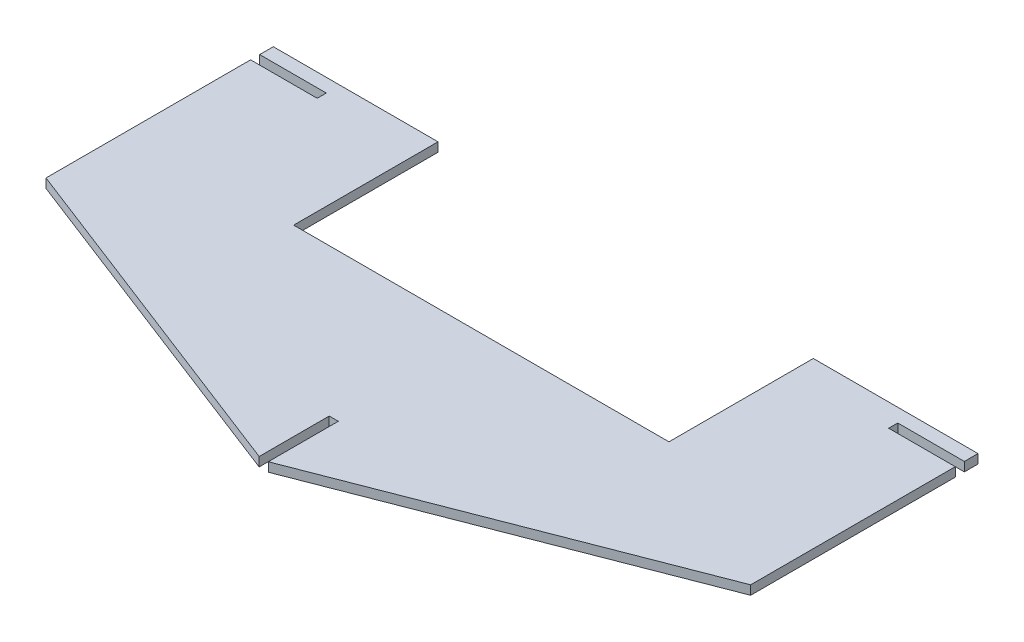
ISO-10303-21;
HEADER;
FILE_DESCRIPTION(('STEP AP214'),'2;1');
FILE_NAME('part.step','',(''),(''),'','','');
FILE_SCHEMA(('AUTOMOTIVE_DESIGN { 1 0 10303 214 1 1 1 1 }'));
ENDSEC;
DATA;
#1=APPLICATION_CONTEXT('core data for automotive mechanical design processes');
#2=APPLICATION_PROTOCOL_DEFINITION('international standard','automotive_design',2000,#1);
#3=PRODUCT_CONTEXT('',#1,'mechanical');
#4=PRODUCT('Part','Part','',(#3));
#5=PRODUCT_RELATED_PRODUCT_CATEGORY('part','',(#4));
#6=PRODUCT_DEFINITION_FORMATION('','',#4);
#7=PRODUCT_DEFINITION_CONTEXT('part definition',#1,'design');
#8=PRODUCT_DEFINITION('design','',#6,#7);
#9=PRODUCT_DEFINITION_SHAPE('','',#8);
#10=(LENGTH_UNIT() NAMED_UNIT(*) SI_UNIT(.MILLI.,.METRE.));
#11=(NAMED_UNIT(*) PLANE_ANGLE_UNIT() SI_UNIT($,.RADIAN.));
#12=(NAMED_UNIT(*) SI_UNIT($,.STERADIAN.) SOLID_ANGLE_UNIT());
#13=UNCERTAINTY_MEASURE_WITH_UNIT(LENGTH_MEASURE(1.E-05),#10,'distance_accuracy_value','');
#14=(GEOMETRIC_REPRESENTATION_CONTEXT(3) GLOBAL_UNCERTAINTY_ASSIGNED_CONTEXT((#13)) GLOBAL_UNIT_ASSIGNED_CONTEXT((#10,
#11,#12)) REPRESENTATION_CONTEXT('',''));
#15=CARTESIAN_POINT('',(0.,0.,0.));
#16=DIRECTION('',(0.,0.,1.));
#17=DIRECTION('',(1.,0.,0.));
#18=AXIS2_PLACEMENT_3D('',#15,#16,#17);
#19=CARTESIAN_POINT('',(0.,4.,0.));
#20=DIRECTION('',(0.,0.,-1.));
#21=DIRECTION('',(-1.,0.,0.));
#22=AXIS2_PLACEMENT_3D('',#19,#20,#21);
#23=PLANE('',#22);
#24=DIRECTION('',(0.,1.,0.));
#25=VECTOR('',#24,1.);
#26=CARTESIAN_POINT('',(72.45,0.,0.));
#27=LINE('',#26,#25);
#28=CARTESIAN_POINT('',(72.45,0.,0.));
#29=VERTEX_POINT('',#28);
#30=CARTESIAN_POINT('',(72.45,4.,0.));
#31=VERTEX_POINT('',#30);
#32=EDGE_CURVE('E196',#29,#31,#27,.T.);
#33=ORIENTED_EDGE('',*,*,#32,.F.);
#34=DIRECTION('',(1.,0.,0.));
#35=VECTOR('',#34,1.);
#36=CARTESIAN_POINT('',(0.,0.,0.));
#37=LINE('',#36,#35);
#38=CARTESIAN_POINT('',(0.,0.,0.));
#39=VERTEX_POINT('',#38);
#40=EDGE_CURVE('E209',#39,#29,#37,.T.);
#41=ORIENTED_EDGE('',*,*,#40,.F.);
#42=DIRECTION('',(0.,-1.,0.));
#43=VECTOR('',#42,1.);
#44=CARTESIAN_POINT('',(0.,4.,0.));
#45=LINE('',#44,#43);
#46=CARTESIAN_POINT('',(0.,4.,0.));
#47=VERTEX_POINT('',#46);
#48=EDGE_CURVE('E248',#47,#39,#45,.T.);
#49=ORIENTED_EDGE('',*,*,#48,.F.);
#50=DIRECTION('',(1.,0.,0.));
#51=VECTOR('',#50,1.);
#52=CARTESIAN_POINT('',(0.,4.,0.));
#53=LINE('',#52,#51);
#54=EDGE_CURVE('E313',#47,#31,#53,.T.);
#55=ORIENTED_EDGE('',*,*,#54,.T.);
#56=EDGE_LOOP('',(#33,#41,#49,#55));
#57=FACE_BOUND('',#56,.T.);
#58=ADVANCED_FACE('F35',(#57),#23,.T.);
#59=CARTESIAN_POINT('',(74.0633484162896,4.,191.330316742081));
#60=DIRECTION('',(-0.360994102557712,0.,-0.93256809827409));
#61=DIRECTION('',(-0.93256809827409,0.,0.360994102557712));
#62=AXIS2_PLACEMENT_3D('',#59,#60,#61);
#63=PLANE('',#62);
#64=DIRECTION('',(0.93256809827409,0.,-0.360994102557712));
#65=VECTOR('',#64,1.);
#66=CARTESIAN_POINT('',(74.0633484162896,0.,191.330316742081));
#67=LINE('',#66,#65);
#68=CARTESIAN_POINT('',(157.,0.,159.225806451613));
#69=VERTEX_POINT('',#68);
#70=CARTESIAN_POINT('',(310.,0.,100.));
#71=VERTEX_POINT('',#70);
#72=EDGE_CURVE('E193',#69,#71,#67,.T.);
#73=ORIENTED_EDGE('',*,*,#72,.T.);
#74=DIRECTION('',(0.,-1.,0.));
#75=VECTOR('',#74,1.);
#76=CARTESIAN_POINT('',(310.,4.,100.));
#77=LINE('',#76,#75);
#78=CARTESIAN_POINT('',(310.,4.,100.));
#79=VERTEX_POINT('',#78);
#80=EDGE_CURVE('E11',#79,#71,#77,.T.);
#81=ORIENTED_EDGE('',*,*,#80,.F.);
#82=DIRECTION('',(0.93256809827409,0.,-0.360994102557712));
#83=VECTOR('',#82,1.);
#84=CARTESIAN_POINT('',(74.0633484162896,4.,191.330316742081));
#85=LINE('',#84,#83);
#86=CARTESIAN_POINT('',(157.,4.,159.225806451613));
#87=VERTEX_POINT('',#86);
#88=EDGE_CURVE('E121',#87,#79,#85,.T.);
#89=ORIENTED_EDGE('',*,*,#88,.F.);
#90=DIRECTION('',(0.,-1.,0.));
#91=VECTOR('',#90,1.);
#92=CARTESIAN_POINT('',(157.,4.,159.225806451613));
#93=LINE('',#92,#91);
#94=EDGE_CURVE('E59',#87,#69,#93,.T.);
#95=ORIENTED_EDGE('',*,*,#94,.T.);
#96=EDGE_LOOP('',(#73,#81,#89,#95));
#97=FACE_BOUND('',#96,.T.);
#98=ADVANCED_FACE('F37',(#97),#63,.F.);
#99=CARTESIAN_POINT('',(310.,4.,0.));
#100=DIRECTION('',(1.,0.,0.));
#101=DIRECTION('',(0.,0.,-1.));
#102=AXIS2_PLACEMENT_3D('',#99,#100,#101);
#103=PLANE('',#102);
#104=DIRECTION('',(0.,0.,1.));
#105=VECTOR('',#104,1.);
#106=CARTESIAN_POINT('',(310.,0.,0.));
#107=LINE('',#106,#105);
#108=CARTESIAN_POINT('',(310.,0.,10.));
#109=VERTEX_POINT('',#108);
#110=EDGE_CURVE('E195',#109,#71,#107,.T.);
#111=ORIENTED_EDGE('',*,*,#110,.F.);
#112=DIRECTION('',(0.,-1.,0.));
#113=VECTOR('',#112,1.);
#114=CARTESIAN_POINT('',(310.,4.,10.));
#115=LINE('',#114,#113);
#116=CARTESIAN_POINT('',(310.,4.,10.));
#117=VERTEX_POINT('',#116);
#118=EDGE_CURVE('E43',#117,#109,#115,.T.);
#119=ORIENTED_EDGE('',*,*,#118,.F.);
#120=DIRECTION('',(0.,0.,1.));
#121=VECTOR('',#120,1.);
#122=CARTESIAN_POINT('',(310.,4.,0.));
#123=LINE('',#122,#121);
#124=EDGE_CURVE('E271',#117,#79,#123,.T.);
#125=ORIENTED_EDGE('',*,*,#124,.T.);
#126=ORIENTED_EDGE('',*,*,#80,.T.);
#127=EDGE_LOOP('',(#111,#119,#125,#126));
#128=FACE_BOUND('',#127,.T.);
#129=ADVANCED_FACE('F270',(#128),#103,.T.);
#130=CARTESIAN_POINT('',(0.,4.,10.));
#131=DIRECTION('',(0.,0.,1.));
#132=DIRECTION('',(1.,0.,0.));
#133=AXIS2_PLACEMENT_3D('',#130,#131,#132);
#134=PLANE('',#133);
#135=DIRECTION('',(-1.,0.,0.));
#136=VECTOR('',#135,1.);
#137=CARTESIAN_POINT('',(0.,0.,10.));
#138=LINE('',#137,#136);
#139=CARTESIAN_POINT('',(280.7,0.,10.));
#140=VERTEX_POINT('',#139);
#141=EDGE_CURVE('E199',#109,#140,#138,.T.);
#142=ORIENTED_EDGE('',*,*,#141,.T.);
#143=DIRECTION('',(0.,-1.,0.));
#144=VECTOR('',#143,1.);
#145=CARTESIAN_POINT('',(280.7,4.,10.));
#146=LINE('',#145,#144);
#147=CARTESIAN_POINT('',(280.7,4.,10.));
#148=VERTEX_POINT('',#147);
#149=EDGE_CURVE('E257',#148,#140,#146,.T.);
#150=ORIENTED_EDGE('',*,*,#149,.F.);
#151=DIRECTION('',(-1.,0.,0.));
#152=VECTOR('',#151,1.);
#153=CARTESIAN_POINT('',(0.,4.,10.));
#154=LINE('',#153,#152);
#155=EDGE_CURVE('E263',#117,#148,#154,.T.);
#156=ORIENTED_EDGE('',*,*,#155,.F.);
#157=ORIENTED_EDGE('',*,*,#118,.T.);
#158=EDGE_LOOP('',(#142,#150,#156,#157));
#159=FACE_BOUND('',#158,.T.);
#160=ADVANCED_FACE('F261',(#159),#134,.F.);
#161=CARTESIAN_POINT('',(280.7,4.,0.));
#162=DIRECTION('',(1.,0.,0.));
#163=DIRECTION('',(0.,0.,-1.));
#164=AXIS2_PLACEMENT_3D('',#161,#162,#163);
#165=PLANE('',#164);
#166=DIRECTION('',(0.,0.,1.));
#167=VECTOR('',#166,1.);
#168=CARTESIAN_POINT('',(280.7,0.,0.));
#169=LINE('',#168,#167);
#170=CARTESIAN_POINT('',(280.7,0.,6.));
#171=VERTEX_POINT('',#170);
#172=EDGE_CURVE('E203',#171,#140,#169,.T.);
#173=ORIENTED_EDGE('',*,*,#172,.F.);
#174=DIRECTION('',(0.,-1.,0.));
#175=VECTOR('',#174,1.);
#176=CARTESIAN_POINT('',(280.7,4.,6.));
#177=LINE('',#176,#175);
#178=CARTESIAN_POINT('',(280.7,4.,6.));
#179=VERTEX_POINT('',#178);
#180=EDGE_CURVE('E255',#179,#171,#177,.T.);
#181=ORIENTED_EDGE('',*,*,#180,.F.);
#182=DIRECTION('',(0.,0.,1.));
#183=VECTOR('',#182,1.);
#184=CARTESIAN_POINT('',(280.7,4.,0.));
#185=LINE('',#184,#183);
#186=EDGE_CURVE('E336',#179,#148,#185,.T.);
#187=ORIENTED_EDGE('',*,*,#186,.T.);
#188=ORIENTED_EDGE('',*,*,#149,.T.);
#189=EDGE_LOOP('',(#173,#181,#187,#188));
#190=FACE_BOUND('',#189,.T.);
#191=ADVANCED_FACE('F414',(#190),#165,.T.);
#192=CARTESIAN_POINT('',(0.,4.,5.99999999999999));
#193=DIRECTION('',(0.,0.,1.));
#194=DIRECTION('',(1.,0.,0.));
#195=AXIS2_PLACEMENT_3D('',#192,#193,#194);
#196=PLANE('',#195);
#197=DIRECTION('',(-1.,0.,0.));
#198=VECTOR('',#197,1.);
#199=CARTESIAN_POINT('',(0.,0.,5.99999999999999));
#200=LINE('',#199,#198);
#201=CARTESIAN_POINT('',(310.,0.,6.));
#202=VERTEX_POINT('',#201);
#203=EDGE_CURVE('E206',#202,#171,#200,.T.);
#204=ORIENTED_EDGE('',*,*,#203,.F.);
#205=DIRECTION('',(0.,-1.,0.));
#206=VECTOR('',#205,1.);
#207=CARTESIAN_POINT('',(310.,4.,6.));
#208=LINE('',#207,#206);
#209=CARTESIAN_POINT('',(310.,4.,6.));
#210=VERTEX_POINT('',#209);
#211=EDGE_CURVE('E253',#210,#202,#208,.T.);
#212=ORIENTED_EDGE('',*,*,#211,.F.);
#213=DIRECTION('',(-1.,0.,0.));
#214=VECTOR('',#213,1.);
#215=CARTESIAN_POINT('',(0.,4.,5.99999999999999));
#216=LINE('',#215,#214);
#217=EDGE_CURVE('E339',#210,#179,#216,.T.);
#218=ORIENTED_EDGE('',*,*,#217,.T.);
#219=ORIENTED_EDGE('',*,*,#180,.T.);
#220=EDGE_LOOP('',(#204,#212,#218,#219));
#221=FACE_BOUND('',#220,.T.);
#222=ADVANCED_FACE('F410',(#221),#196,.T.);
#223=CARTESIAN_POINT('',(310.,0.,0.));
#224=VERTEX_POINT('',#223);
#225=EDGE_CURVE('E200',#224,#202,#107,.T.);
#226=ORIENTED_EDGE('',*,*,#225,.F.);
#227=DIRECTION('',(0.,-1.,0.));
#228=VECTOR('',#227,1.);
#229=CARTESIAN_POINT('',(310.,4.,0.));
#230=LINE('',#229,#228);
#231=CARTESIAN_POINT('',(310.,4.,0.));
#232=VERTEX_POINT('',#231);
#233=EDGE_CURVE('E250',#232,#224,#230,.T.);
#234=ORIENTED_EDGE('',*,*,#233,.F.);
#235=EDGE_CURVE('E334',#232,#210,#123,.T.);
#236=ORIENTED_EDGE('',*,*,#235,.T.);
#237=ORIENTED_EDGE('',*,*,#211,.T.);
#238=EDGE_LOOP('',(#226,#234,#236,#237));
#239=FACE_BOUND('',#238,.T.);
#240=ADVANCED_FACE('F376',(#239),#103,.T.);
#241=DIRECTION('',(0.,1.,0.));
#242=VECTOR('',#241,1.);
#243=CARTESIAN_POINT('',(237.55,0.,0.));
#244=LINE('',#243,#242);
#245=CARTESIAN_POINT('',(237.55,0.,0.));
#246=VERTEX_POINT('',#245);
#247=CARTESIAN_POINT('',(237.55,4.,0.));
#248=VERTEX_POINT('',#247);
#249=EDGE_CURVE('E319',#246,#248,#244,.T.);
#250=ORIENTED_EDGE('',*,*,#249,.T.);
#251=EDGE_CURVE('E343',#248,#232,#53,.T.);
#252=ORIENTED_EDGE('',*,*,#251,.T.);
#253=ORIENTED_EDGE('',*,*,#233,.T.);
#254=EDGE_CURVE('E213',#246,#224,#37,.T.);
#255=ORIENTED_EDGE('',*,*,#254,.F.);
#256=EDGE_LOOP('',(#250,#252,#253,#255));
#257=FACE_BOUND('',#256,.T.);
#258=ADVANCED_FACE('F369',(#257),#23,.T.);
#259=CARTESIAN_POINT('',(0.,4.,0.));
#260=DIRECTION('',(1.,0.,0.));
#261=DIRECTION('',(0.,0.,-1.));
#262=AXIS2_PLACEMENT_3D('',#259,#260,#261);
#263=PLANE('',#262);
#264=DIRECTION('',(0.,0.,1.));
#265=VECTOR('',#264,1.);
#266=CARTESIAN_POINT('',(0.,0.,0.));
#267=LINE('',#266,#265);
#268=CARTESIAN_POINT('',(0.,0.,6.));
#269=VERTEX_POINT('',#268);
#270=EDGE_CURVE('E212',#39,#269,#267,.T.);
#271=ORIENTED_EDGE('',*,*,#270,.T.);
#272=DIRECTION('',(0.,-1.,0.));
#273=VECTOR('',#272,1.);
#274=CARTESIAN_POINT('',(0.,4.,6.));
#275=LINE('',#274,#273);
#276=CARTESIAN_POINT('',(0.,4.,6.));
#277=VERTEX_POINT('',#276);
#278=EDGE_CURVE('E245',#277,#269,#275,.T.);
#279=ORIENTED_EDGE('',*,*,#278,.F.);
#280=DIRECTION('',(0.,0.,1.));
#281=VECTOR('',#280,1.);
#282=CARTESIAN_POINT('',(0.,4.,0.));
#283=LINE('',#282,#281);
#284=EDGE_CURVE('E305',#47,#277,#283,.T.);
#285=ORIENTED_EDGE('',*,*,#284,.F.);
#286=ORIENTED_EDGE('',*,*,#48,.T.);
#287=EDGE_LOOP('',(#271,#279,#285,#286));
#288=FACE_BOUND('',#287,.T.);
#289=ADVANCED_FACE('F304',(#288),#263,.F.);
#290=CARTESIAN_POINT('',(0.,4.,6.));
#291=DIRECTION('',(0.,0.,-1.));
#292=DIRECTION('',(-1.,0.,0.));
#293=AXIS2_PLACEMENT_3D('',#290,#291,#292);
#294=PLANE('',#293);
#295=DIRECTION('',(1.,0.,0.));
#296=VECTOR('',#295,1.);
#297=CARTESIAN_POINT('',(0.,0.,6.));
#298=LINE('',#297,#296);
#299=CARTESIAN_POINT('',(29.3,0.,6.));
#300=VERTEX_POINT('',#299);
#301=EDGE_CURVE('E215',#269,#300,#298,.T.);
#302=ORIENTED_EDGE('',*,*,#301,.T.);
#303=DIRECTION('',(0.,-1.,0.));
#304=VECTOR('',#303,1.);
#305=CARTESIAN_POINT('',(29.3,4.,6.));
#306=LINE('',#305,#304);
#307=CARTESIAN_POINT('',(29.3,4.,6.));
#308=VERTEX_POINT('',#307);
#309=EDGE_CURVE('E242',#308,#300,#306,.T.);
#310=ORIENTED_EDGE('',*,*,#309,.F.);
#311=DIRECTION('',(1.,0.,0.));
#312=VECTOR('',#311,1.);
#313=CARTESIAN_POINT('',(0.,4.,6.));
#314=LINE('',#313,#312);
#315=EDGE_CURVE('E300',#277,#308,#314,.T.);
#316=ORIENTED_EDGE('',*,*,#315,.F.);
#317=ORIENTED_EDGE('',*,*,#278,.T.);
#318=EDGE_LOOP('',(#302,#310,#316,#317));
#319=FACE_BOUND('',#318,.T.);
#320=ADVANCED_FACE('F299',(#319),#294,.F.);
#321=CARTESIAN_POINT('',(29.3,4.,0.));
#322=DIRECTION('',(1.,0.,0.));
#323=DIRECTION('',(0.,0.,-1.));
#324=AXIS2_PLACEMENT_3D('',#321,#322,#323);
#325=PLANE('',#324);
#326=DIRECTION('',(0.,0.,1.));
#327=VECTOR('',#326,1.);
#328=CARTESIAN_POINT('',(29.3,0.,0.));
#329=LINE('',#328,#327);
#330=CARTESIAN_POINT('',(29.3,0.,10.));
#331=VERTEX_POINT('',#330);
#332=EDGE_CURVE('E218',#300,#331,#329,.T.);
#333=ORIENTED_EDGE('',*,*,#332,.T.);
#334=DIRECTION('',(0.,-1.,0.));
#335=VECTOR('',#334,1.);
#336=CARTESIAN_POINT('',(29.3,4.,10.));
#337=LINE('',#336,#335);
#338=CARTESIAN_POINT('',(29.3,4.,10.));
#339=VERTEX_POINT('',#338);
#340=EDGE_CURVE('E240',#339,#331,#337,.T.);
#341=ORIENTED_EDGE('',*,*,#340,.F.);
#342=DIRECTION('',(0.,0.,1.));
#343=VECTOR('',#342,1.);
#344=CARTESIAN_POINT('',(29.3,4.,0.));
#345=LINE('',#344,#343);
#346=EDGE_CURVE('E296',#308,#339,#345,.T.);
#347=ORIENTED_EDGE('',*,*,#346,.F.);
#348=ORIENTED_EDGE('',*,*,#309,.T.);
#349=EDGE_LOOP('',(#333,#341,#347,#348));
#350=FACE_BOUND('',#349,.T.);
#351=ADVANCED_FACE('F293',(#350),#325,.F.);
#352=CARTESIAN_POINT('',(0.,4.,10.));
#353=DIRECTION('',(0.,0.,-1.));
#354=DIRECTION('',(-1.,0.,0.));
#355=AXIS2_PLACEMENT_3D('',#352,#353,#354);
#356=PLANE('',#355);
#357=DIRECTION('',(1.,0.,0.));
#358=VECTOR('',#357,1.);
#359=CARTESIAN_POINT('',(0.,0.,10.));
#360=LINE('',#359,#358);
#361=CARTESIAN_POINT('',(0.,0.,10.));
#362=VERTEX_POINT('',#361);
#363=EDGE_CURVE('E221',#362,#331,#360,.T.);
#364=ORIENTED_EDGE('',*,*,#363,.F.);
#365=DIRECTION('',(0.,-1.,0.));
#366=VECTOR('',#365,1.);
#367=CARTESIAN_POINT('',(0.,4.,10.));
#368=LINE('',#367,#366);
#369=CARTESIAN_POINT('',(0.,4.,10.));
#370=VERTEX_POINT('',#369);
#371=EDGE_CURVE('E238',#370,#362,#368,.T.);
#372=ORIENTED_EDGE('',*,*,#371,.F.);
#373=DIRECTION('',(1.,0.,0.));
#374=VECTOR('',#373,1.);
#375=CARTESIAN_POINT('',(0.,4.,10.));
#376=LINE('',#375,#374);
#377=EDGE_CURVE('E287',#370,#339,#376,.T.);
#378=ORIENTED_EDGE('',*,*,#377,.T.);
#379=ORIENTED_EDGE('',*,*,#340,.T.);
#380=EDGE_LOOP('',(#364,#372,#378,#379));
#381=FACE_BOUND('',#380,.T.);
#382=ADVANCED_FACE('F286',(#381),#356,.T.);
#383=CARTESIAN_POINT('',(0.,0.,100.));
#384=VERTEX_POINT('',#383);
#385=EDGE_CURVE('E216',#362,#384,#267,.T.);
#386=ORIENTED_EDGE('',*,*,#385,.T.);
#387=DIRECTION('',(0.,-1.,0.));
#388=VECTOR('',#387,1.);
#389=CARTESIAN_POINT('',(0.,4.,100.));
#390=LINE('',#389,#388);
#391=CARTESIAN_POINT('',(0.,4.,100.));
#392=VERTEX_POINT('',#391);
#393=EDGE_CURVE('E235',#392,#384,#390,.T.);
#394=ORIENTED_EDGE('',*,*,#393,.F.);
#395=EDGE_CURVE('E282',#370,#392,#283,.T.);
#396=ORIENTED_EDGE('',*,*,#395,.F.);
#397=ORIENTED_EDGE('',*,*,#371,.T.);
#398=EDGE_LOOP('',(#386,#394,#396,#397));
#399=FACE_BOUND('',#398,.T.);
#400=ADVANCED_FACE('F281',(#399),#263,.F.);
#401=CARTESIAN_POINT('',(-33.6651583710407,4.,86.9683257918552));
#402=DIRECTION('',(0.360994102557712,0.,-0.93256809827409));
#403=DIRECTION('',(-0.93256809827409,0.,-0.360994102557712));
#404=AXIS2_PLACEMENT_3D('',#401,#402,#403);
#405=PLANE('',#404);
#406=DIRECTION('',(0.93256809827409,0.,0.360994102557712));
#407=VECTOR('',#406,1.);
#408=CARTESIAN_POINT('',(-33.6651583710407,0.,86.9683257918552));
#409=LINE('',#408,#407);
#410=CARTESIAN_POINT('',(153.,0.,159.225806451613));
#411=VERTEX_POINT('',#410);
#412=EDGE_CURVE('E224',#384,#411,#409,.T.);
#413=ORIENTED_EDGE('',*,*,#412,.T.);
#414=DIRECTION('',(0.,-1.,0.));
#415=VECTOR('',#414,1.);
#416=CARTESIAN_POINT('',(153.,4.,159.225806451613));
#417=LINE('',#416,#415);
#418=CARTESIAN_POINT('',(153.,4.,159.225806451613));
#419=VERTEX_POINT('',#418);
#420=EDGE_CURVE('E184',#419,#411,#417,.T.);
#421=ORIENTED_EDGE('',*,*,#420,.F.);
#422=DIRECTION('',(0.93256809827409,0.,0.360994102557712));
#423=VECTOR('',#422,1.);
#424=CARTESIAN_POINT('',(-33.6651583710407,4.,86.9683257918552));
#425=LINE('',#424,#423);
#426=EDGE_CURVE('E171',#392,#419,#425,.T.);
#427=ORIENTED_EDGE('',*,*,#426,.F.);
#428=ORIENTED_EDGE('',*,*,#393,.T.);
#429=EDGE_LOOP('',(#413,#421,#427,#428));
#430=FACE_BOUND('',#429,.T.);
#431=ADVANCED_FACE('F277',(#430),#405,.F.);
#432=CARTESIAN_POINT('',(153.,4.,0.));
#433=DIRECTION('',(-1.,0.,0.));
#434=DIRECTION('',(0.,0.,1.));
#435=AXIS2_PLACEMENT_3D('',#432,#433,#434);
#436=PLANE('',#435);
#437=DIRECTION('',(0.,0.,-1.));
#438=VECTOR('',#437,1.);
#439=CARTESIAN_POINT('',(153.,0.,0.));
#440=LINE('',#439,#438);
#441=CARTESIAN_POINT('',(153.,0.,128.4));
#442=VERTEX_POINT('',#441);
#443=EDGE_CURVE('E180',#411,#442,#440,.T.);
#444=ORIENTED_EDGE('',*,*,#443,.T.);
#445=DIRECTION('',(0.,-1.,0.));
#446=VECTOR('',#445,1.);
#447=CARTESIAN_POINT('',(153.,4.,128.4));
#448=LINE('',#447,#446);
#449=CARTESIAN_POINT('',(153.,4.,128.4));
#450=VERTEX_POINT('',#449);
#451=EDGE_CURVE('E177',#450,#442,#448,.T.);
#452=ORIENTED_EDGE('',*,*,#451,.F.);
#453=DIRECTION('',(0.,0.,-1.));
#454=VECTOR('',#453,1.);
#455=CARTESIAN_POINT('',(153.,4.,0.));
#456=LINE('',#455,#454);
#457=EDGE_CURVE('E163',#419,#450,#456,.T.);
#458=ORIENTED_EDGE('',*,*,#457,.F.);
#459=ORIENTED_EDGE('',*,*,#420,.T.);
#460=EDGE_LOOP('',(#444,#452,#458,#459));
#461=FACE_BOUND('',#460,.T.);
#462=ADVANCED_FACE('F178',(#461),#436,.F.);
#463=CARTESIAN_POINT('',(0.,4.,128.4));
#464=DIRECTION('',(0.,0.,-1.));
#465=DIRECTION('',(-1.,0.,0.));
#466=AXIS2_PLACEMENT_3D('',#463,#464,#465);
#467=PLANE('',#466);
#468=DIRECTION('',(1.,0.,0.));
#469=VECTOR('',#468,1.);
#470=CARTESIAN_POINT('',(0.,0.,128.4));
#471=LINE('',#470,#469);
#472=CARTESIAN_POINT('',(157.,0.,128.4));
#473=VERTEX_POINT('',#472);
#474=EDGE_CURVE('E227',#442,#473,#471,.T.);
#475=ORIENTED_EDGE('',*,*,#474,.T.);
#476=DIRECTION('',(0.,-1.,0.));
#477=VECTOR('',#476,1.);
#478=CARTESIAN_POINT('',(157.,4.,128.4));
#479=LINE('',#478,#477);
#480=CARTESIAN_POINT('',(157.,4.,128.4));
#481=VERTEX_POINT('',#480);
#482=EDGE_CURVE('E185',#481,#473,#479,.T.);
#483=ORIENTED_EDGE('',*,*,#482,.F.);
#484=DIRECTION('',(1.,0.,0.));
#485=VECTOR('',#484,1.);
#486=CARTESIAN_POINT('',(0.,4.,128.4));
#487=LINE('',#486,#485);
#488=EDGE_CURVE('E168',#450,#481,#487,.T.);
#489=ORIENTED_EDGE('',*,*,#488,.F.);
#490=ORIENTED_EDGE('',*,*,#451,.T.);
#491=EDGE_LOOP('',(#475,#483,#489,#490));
#492=FACE_BOUND('',#491,.T.);
#493=ADVANCED_FACE('F187',(#492),#467,.F.);
#494=CARTESIAN_POINT('',(157.,4.,0.));
#495=DIRECTION('',(-1.,0.,0.));
#496=DIRECTION('',(0.,0.,1.));
#497=AXIS2_PLACEMENT_3D('',#494,#495,#496);
#498=PLANE('',#497);
#499=DIRECTION('',(0.,0.,-1.));
#500=VECTOR('',#499,1.);
#501=CARTESIAN_POINT('',(157.,0.,0.));
#502=LINE('',#501,#500);
#503=EDGE_CURVE('E229',#69,#473,#502,.T.);
#504=ORIENTED_EDGE('',*,*,#503,.F.);
#505=ORIENTED_EDGE('',*,*,#94,.F.);
#506=DIRECTION('',(0.,0.,-1.));
#507=VECTOR('',#506,1.);
#508=CARTESIAN_POINT('',(157.,4.,0.));
#509=LINE('',#508,#507);
#510=EDGE_CURVE('E188',#87,#481,#509,.T.);
#511=ORIENTED_EDGE('',*,*,#510,.T.);
#512=ORIENTED_EDGE('',*,*,#482,.T.);
#513=EDGE_LOOP('',(#504,#505,#511,#512));
#514=FACE_BOUND('',#513,.T.);
#515=ADVANCED_FACE('F272',(#514),#498,.T.);
#516=CARTESIAN_POINT('',(0.,4.,0.));
#517=DIRECTION('',(0.,1.,0.));
#518=DIRECTION('',(0.,0.,1.));
#519=AXIS2_PLACEMENT_3D('',#516,#517,#518);
#520=PLANE('',#519);
#521=DIRECTION('',(0.,0.,1.));
#522=VECTOR('',#521,1.);
#523=CARTESIAN_POINT('',(72.45,4.,0.));
#524=LINE('',#523,#522);
#525=CARTESIAN_POINT('',(72.45,4.,63.5));
#526=VERTEX_POINT('',#525);
#527=EDGE_CURVE('E348',#31,#526,#524,.T.);
#528=ORIENTED_EDGE('',*,*,#527,.F.);
#529=ORIENTED_EDGE('',*,*,#54,.F.);
#530=ORIENTED_EDGE('',*,*,#284,.T.);
#531=ORIENTED_EDGE('',*,*,#315,.T.);
#532=ORIENTED_EDGE('',*,*,#346,.T.);
#533=ORIENTED_EDGE('',*,*,#377,.F.);
#534=ORIENTED_EDGE('',*,*,#395,.T.);
#535=ORIENTED_EDGE('',*,*,#426,.T.);
#536=ORIENTED_EDGE('',*,*,#457,.T.);
#537=ORIENTED_EDGE('',*,*,#488,.T.);
#538=ORIENTED_EDGE('',*,*,#510,.F.);
#539=ORIENTED_EDGE('',*,*,#88,.T.);
#540=ORIENTED_EDGE('',*,*,#124,.F.);
#541=ORIENTED_EDGE('',*,*,#155,.T.);
#542=ORIENTED_EDGE('',*,*,#186,.F.);
#543=ORIENTED_EDGE('',*,*,#217,.F.);
#544=ORIENTED_EDGE('',*,*,#235,.F.);
#545=ORIENTED_EDGE('',*,*,#251,.F.);
#546=DIRECTION('',(0.,0.,-1.));
#547=VECTOR('',#546,1.);
#548=CARTESIAN_POINT('',(237.55,4.,0.));
#549=LINE('',#548,#547);
#550=CARTESIAN_POINT('',(237.55,4.,63.5));
#551=VERTEX_POINT('',#550);
#552=EDGE_CURVE('E325',#551,#248,#549,.T.);
#553=ORIENTED_EDGE('',*,*,#552,.F.);
#554=DIRECTION('',(1.,0.,0.));
#555=VECTOR('',#554,1.);
#556=CARTESIAN_POINT('',(72.45,4.,63.5));
#557=LINE('',#556,#555);
#558=EDGE_CURVE('E352',#526,#551,#557,.T.);
#559=ORIENTED_EDGE('',*,*,#558,.F.);
#560=EDGE_LOOP('',(#528,#529,#530,#531,#532,#533,#534,#535,#536,#537,#538,#539,#540,#541,#542,
#543,#544,#545,#553,#559));
#561=FACE_BOUND('',#560,.T.);
#562=ADVANCED_FACE('F166',(#561),#520,.T.);
#563=CARTESIAN_POINT('',(0.,0.,0.));
#564=DIRECTION('',(0.,1.,0.));
#565=DIRECTION('',(0.,0.,1.));
#566=AXIS2_PLACEMENT_3D('',#563,#564,#565);
#567=PLANE('',#566);
#568=ORIENTED_EDGE('',*,*,#40,.T.);
#569=DIRECTION('',(0.,0.,1.));
#570=VECTOR('',#569,1.);
#571=CARTESIAN_POINT('',(72.45,0.,0.));
#572=LINE('',#571,#570);
#573=CARTESIAN_POINT('',(72.45,0.,63.5));
#574=VERTEX_POINT('',#573);
#575=EDGE_CURVE('E362',#29,#574,#572,.T.);
#576=ORIENTED_EDGE('',*,*,#575,.T.);
#577=DIRECTION('',(1.,0.,0.));
#578=VECTOR('',#577,1.);
#579=CARTESIAN_POINT('',(72.45,0.,63.5));
#580=LINE('',#579,#578);
#581=CARTESIAN_POINT('',(237.55,0.,63.5));
#582=VERTEX_POINT('',#581);
#583=EDGE_CURVE('E359',#574,#582,#580,.T.);
#584=ORIENTED_EDGE('',*,*,#583,.T.);
#585=DIRECTION('',(0.,0.,-1.));
#586=VECTOR('',#585,1.);
#587=CARTESIAN_POINT('',(237.55,0.,0.));
#588=LINE('',#587,#586);
#589=EDGE_CURVE('E50',#582,#246,#588,.T.);
#590=ORIENTED_EDGE('',*,*,#589,.T.);
#591=ORIENTED_EDGE('',*,*,#254,.T.);
#592=ORIENTED_EDGE('',*,*,#225,.T.);
#593=ORIENTED_EDGE('',*,*,#203,.T.);
#594=ORIENTED_EDGE('',*,*,#172,.T.);
#595=ORIENTED_EDGE('',*,*,#141,.F.);
#596=ORIENTED_EDGE('',*,*,#110,.T.);
#597=ORIENTED_EDGE('',*,*,#72,.F.);
#598=ORIENTED_EDGE('',*,*,#503,.T.);
#599=ORIENTED_EDGE('',*,*,#474,.F.);
#600=ORIENTED_EDGE('',*,*,#443,.F.);
#601=ORIENTED_EDGE('',*,*,#412,.F.);
#602=ORIENTED_EDGE('',*,*,#385,.F.);
#603=ORIENTED_EDGE('',*,*,#363,.T.);
#604=ORIENTED_EDGE('',*,*,#332,.F.);
#605=ORIENTED_EDGE('',*,*,#301,.F.);
#606=ORIENTED_EDGE('',*,*,#270,.F.);
#607=EDGE_LOOP('',(#568,#576,#584,#590,#591,#592,#593,#594,#595,#596,#597,#598,#599,#600,#601,
#602,#603,#604,#605,#606));
#608=FACE_BOUND('',#607,.T.);
#609=ADVANCED_FACE('F268',(#608),#567,.F.);
#610=CARTESIAN_POINT('',(72.45,0.,0.));
#611=DIRECTION('',(-1.,0.,0.));
#612=DIRECTION('',(0.,0.,1.));
#613=AXIS2_PLACEMENT_3D('',#610,#611,#612);
#614=PLANE('',#613);
#615=ORIENTED_EDGE('',*,*,#527,.T.);
#616=DIRECTION('',(0.,1.,0.));
#617=VECTOR('',#616,1.);
#618=CARTESIAN_POINT('',(72.45,0.,63.5));
#619=LINE('',#618,#617);
#620=EDGE_CURVE('E329',#574,#526,#619,.T.);
#621=ORIENTED_EDGE('',*,*,#620,.F.);
#622=ORIENTED_EDGE('',*,*,#575,.F.);
#623=ORIENTED_EDGE('',*,*,#32,.T.);
#624=EDGE_LOOP('',(#615,#621,#622,#623));
#625=FACE_BOUND('',#624,.T.);
#626=ADVANCED_FACE('F386',(#625),#614,.F.);
#627=CARTESIAN_POINT('',(237.55,0.,0.));
#628=DIRECTION('',(1.,0.,0.));
#629=DIRECTION('',(0.,0.,-1.));
#630=AXIS2_PLACEMENT_3D('',#627,#628,#629);
#631=PLANE('',#630);
#632=ORIENTED_EDGE('',*,*,#552,.T.);
#633=ORIENTED_EDGE('',*,*,#249,.F.);
#634=ORIENTED_EDGE('',*,*,#589,.F.);
#635=DIRECTION('',(0.,1.,0.));
#636=VECTOR('',#635,1.);
#637=CARTESIAN_POINT('',(237.55,0.,63.5));
#638=LINE('',#637,#636);
#639=EDGE_CURVE('E322',#582,#551,#638,.T.);
#640=ORIENTED_EDGE('',*,*,#639,.T.);
#641=EDGE_LOOP('',(#632,#633,#634,#640));
#642=FACE_BOUND('',#641,.T.);
#643=ADVANCED_FACE('F364',(#642),#631,.F.);
#644=CARTESIAN_POINT('',(72.45,0.,63.5));
#645=DIRECTION('',(0.,0.,1.));
#646=DIRECTION('',(1.,0.,0.));
#647=AXIS2_PLACEMENT_3D('',#644,#645,#646);
#648=PLANE('',#647);
#649=ORIENTED_EDGE('',*,*,#558,.T.);
#650=ORIENTED_EDGE('',*,*,#639,.F.);
#651=ORIENTED_EDGE('',*,*,#583,.F.);
#652=ORIENTED_EDGE('',*,*,#620,.T.);
#653=EDGE_LOOP('',(#649,#650,#651,#652));
#654=FACE_BOUND('',#653,.T.);
#655=ADVANCED_FACE('F385',(#654),#648,.F.);
#656=CLOSED_SHELL('',(#58,#98,#129,#160,#191,#222,#240,#258,#289,#320,#351,#382,#400,#431,#462,
#493,#515,#562,#609,#626,#643,#655));
#657=MANIFOLD_SOLID_BREP('B2',#656);
#658=ADVANCED_BREP_SHAPE_REPRESENTATION('',(#18,#657),#14);
#659=SHAPE_DEFINITION_REPRESENTATION(#9,#658);
ENDSEC;
END-ISO-10303-21;
